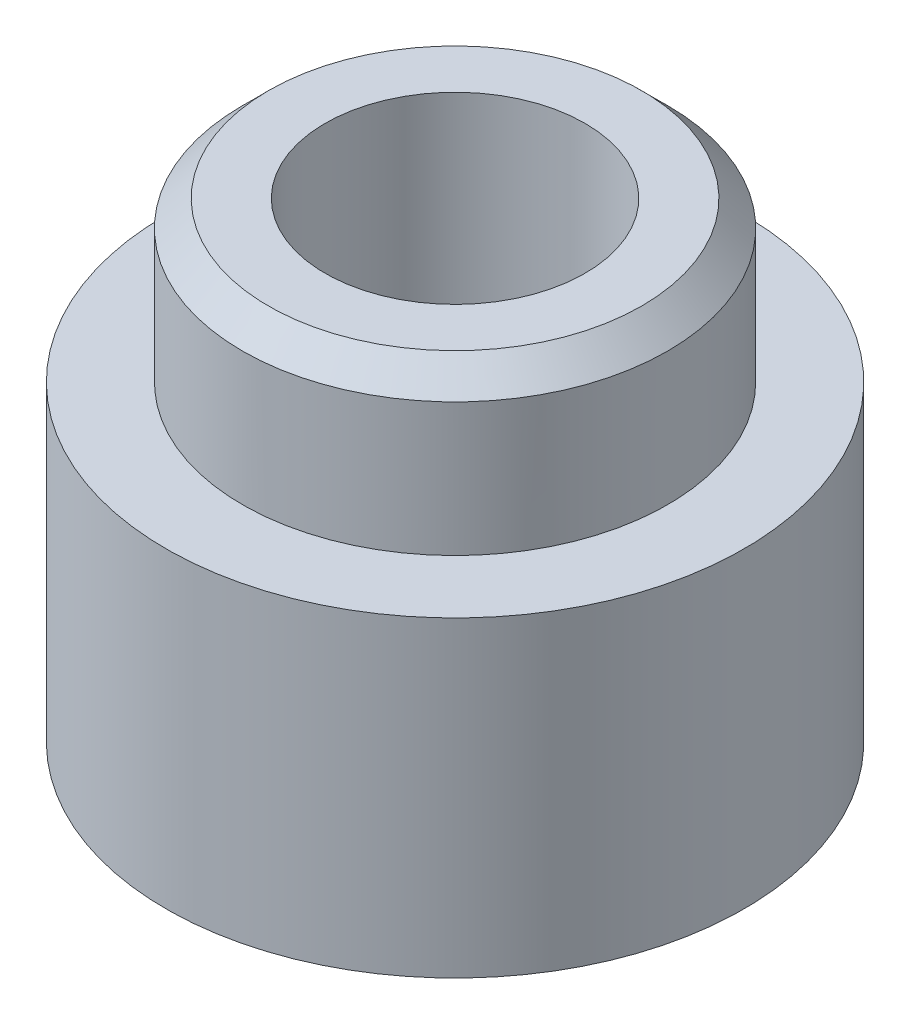
ISO-10303-21;
HEADER;
FILE_DESCRIPTION(('STEP AP214'),'2;1');
FILE_NAME('part.step','',(''),(''),'','','');
FILE_SCHEMA(('AUTOMOTIVE_DESIGN { 1 0 10303 214 1 1 1 1 }'));
ENDSEC;
DATA;
#1=APPLICATION_CONTEXT('core data for automotive mechanical design processes');
#2=APPLICATION_PROTOCOL_DEFINITION('international standard','automotive_design',2000,#1);
#3=PRODUCT_CONTEXT('',#1,'mechanical');
#4=PRODUCT('Part','Part','',(#3));
#5=PRODUCT_RELATED_PRODUCT_CATEGORY('part','',(#4));
#6=PRODUCT_DEFINITION_FORMATION('','',#4);
#7=PRODUCT_DEFINITION_CONTEXT('part definition',#1,'design');
#8=PRODUCT_DEFINITION('design','',#6,#7);
#9=PRODUCT_DEFINITION_SHAPE('','',#8);
#10=(LENGTH_UNIT() NAMED_UNIT(*) SI_UNIT(.MILLI.,.METRE.));
#11=(NAMED_UNIT(*) PLANE_ANGLE_UNIT() SI_UNIT($,.RADIAN.));
#12=(NAMED_UNIT(*) SI_UNIT($,.STERADIAN.) SOLID_ANGLE_UNIT());
#13=UNCERTAINTY_MEASURE_WITH_UNIT(LENGTH_MEASURE(1.E-05),#10,'distance_accuracy_value','');
#14=(GEOMETRIC_REPRESENTATION_CONTEXT(3) GLOBAL_UNCERTAINTY_ASSIGNED_CONTEXT((#13)) GLOBAL_UNIT_ASSIGNED_CONTEXT((#10,
#11,#12)) REPRESENTATION_CONTEXT('',''));
#15=CARTESIAN_POINT('',(0.,0.,0.));
#16=DIRECTION('',(0.,0.,1.));
#17=DIRECTION('',(1.,0.,0.));
#18=AXIS2_PLACEMENT_3D('',#15,#16,#17);
#19=CARTESIAN_POINT('',(0.,0.,0.));
#20=DIRECTION('',(0.,1.,0.));
#21=DIRECTION('',(-1.,0.,0.));
#22=AXIS2_PLACEMENT_3D('',#19,#20,#21);
#23=PLANE('',#22);
#24=CARTESIAN_POINT('',(0.,0.,0.));
#25=DIRECTION('',(0.,-1.,0.));
#26=DIRECTION('',(0.,0.,-1.));
#27=AXIS2_PLACEMENT_3D('',#24,#25,#26);
#28=CIRCLE('',#27,1.25);
#29=CARTESIAN_POINT('',(0.,0.,-1.25));
#30=VERTEX_POINT('',#29);
#31=EDGE_CURVE('E74',#30,#30,#28,.T.);
#32=ORIENTED_EDGE('',*,*,#31,.F.);
#33=EDGE_LOOP('',(#32));
#34=FACE_BOUND('',#33,.T.);
#35=CARTESIAN_POINT('',(0.,0.,0.));
#36=DIRECTION('',(0.,1.,0.));
#37=DIRECTION('',(-1.,0.,0.));
#38=AXIS2_PLACEMENT_3D('',#35,#36,#37);
#39=CIRCLE('',#38,2.78);
#40=CARTESIAN_POINT('',(-2.78,0.,0.));
#41=VERTEX_POINT('',#40);
#42=EDGE_CURVE('E56',#41,#41,#39,.T.);
#43=ORIENTED_EDGE('',*,*,#42,.F.);
#44=EDGE_LOOP('',(#43));
#45=FACE_BOUND('',#44,.T.);
#46=ADVANCED_FACE('F40',(#34,#45),#23,.F.);
#47=CARTESIAN_POINT('',(0.,4.53,0.));
#48=DIRECTION('',(0.,1.,0.));
#49=DIRECTION('',(-1.,0.,0.));
#50=AXIS2_PLACEMENT_3D('',#47,#48,#49);
#51=CYLINDRICAL_SURFACE('',#50,2.78);
#52=CARTESIAN_POINT('',(0.,3.,0.));
#53=DIRECTION('',(0.,1.,0.));
#54=DIRECTION('',(-1.,0.,0.));
#55=AXIS2_PLACEMENT_3D('',#52,#53,#54);
#56=CIRCLE('',#55,2.78);
#57=CARTESIAN_POINT('',(-2.78,3.00000000000001,0.));
#58=VERTEX_POINT('',#57);
#59=EDGE_CURVE('E61',#58,#58,#56,.T.);
#60=ORIENTED_EDGE('',*,*,#59,.F.);
#61=EDGE_LOOP('',(#60));
#62=FACE_BOUND('',#61,.T.);
#63=ORIENTED_EDGE('',*,*,#42,.T.);
#64=EDGE_LOOP('',(#63));
#65=FACE_BOUND('',#64,.T.);
#66=ADVANCED_FACE('F82',(#62,#65),#51,.T.);
#67=CARTESIAN_POINT('',(2.78,3.,0.));
#68=DIRECTION('',(0.,-1.,0.));
#69=DIRECTION('',(1.,0.,0.));
#70=AXIS2_PLACEMENT_3D('',#67,#68,#69);
#71=PLANE('',#70);
#72=CARTESIAN_POINT('',(0.,3.,0.));
#73=DIRECTION('',(0.,1.,0.));
#74=DIRECTION('',(-1.,0.,0.));
#75=AXIS2_PLACEMENT_3D('',#72,#73,#74);
#76=CIRCLE('',#75,2.045);
#77=CARTESIAN_POINT('',(-2.045,3.00000000000001,0.));
#78=VERTEX_POINT('',#77);
#79=EDGE_CURVE('E66',#78,#78,#76,.T.);
#80=ORIENTED_EDGE('',*,*,#79,.F.);
#81=EDGE_LOOP('',(#80));
#82=FACE_BOUND('',#81,.T.);
#83=ORIENTED_EDGE('',*,*,#59,.T.);
#84=EDGE_LOOP('',(#83));
#85=FACE_BOUND('',#84,.T.);
#86=ADVANCED_FACE('F86',(#82,#85),#71,.F.);
#87=CARTESIAN_POINT('',(0.,4.53,0.));
#88=DIRECTION('',(0.,1.,0.));
#89=DIRECTION('',(-1.,0.,0.));
#90=AXIS2_PLACEMENT_3D('',#87,#88,#89);
#91=CYLINDRICAL_SURFACE('',#90,2.045);
#92=CARTESIAN_POINT('',(0.,4.28,0.));
#93=DIRECTION('',(0.,-1.,0.));
#94=DIRECTION('',(1.,0.,0.));
#95=AXIS2_PLACEMENT_3D('',#92,#93,#94);
#96=CIRCLE('',#95,2.045);
#97=CARTESIAN_POINT('',(2.045,4.28,0.));
#98=VERTEX_POINT('',#97);
#99=EDGE_CURVE('E10',#98,#98,#96,.T.);
#100=ORIENTED_EDGE('',*,*,#99,.T.);
#101=EDGE_LOOP('',(#100));
#102=FACE_BOUND('',#101,.T.);
#103=ORIENTED_EDGE('',*,*,#79,.T.);
#104=EDGE_LOOP('',(#103));
#105=FACE_BOUND('',#104,.T.);
#106=ADVANCED_FACE('F92',(#102,#105),#91,.T.);
#107=CARTESIAN_POINT('',(2.045,4.53,0.));
#108=DIRECTION('',(0.,-1.,0.));
#109=DIRECTION('',(1.,0.,0.));
#110=AXIS2_PLACEMENT_3D('',#107,#108,#109);
#111=PLANE('',#110);
#112=CARTESIAN_POINT('',(0.,4.53,0.));
#113=DIRECTION('',(0.,-1.,0.));
#114=DIRECTION('',(0.,0.,-1.));
#115=AXIS2_PLACEMENT_3D('',#112,#113,#114);
#116=CIRCLE('',#115,1.25);
#117=CARTESIAN_POINT('',(0.,4.53,-1.25));
#118=VERTEX_POINT('',#117);
#119=EDGE_CURVE('E70',#118,#118,#116,.T.);
#120=ORIENTED_EDGE('',*,*,#119,.T.);
#121=EDGE_LOOP('',(#120));
#122=FACE_BOUND('',#121,.T.);
#123=CARTESIAN_POINT('',(0.,4.53,0.));
#124=DIRECTION('',(0.,-1.,0.));
#125=DIRECTION('',(1.,0.,0.));
#126=AXIS2_PLACEMENT_3D('',#123,#124,#125);
#127=CIRCLE('',#126,1.795);
#128=CARTESIAN_POINT('',(1.795,4.53,0.));
#129=VERTEX_POINT('',#128);
#130=EDGE_CURVE('E49',#129,#129,#127,.F.);
#131=ORIENTED_EDGE('',*,*,#130,.T.);
#132=EDGE_LOOP('',(#131));
#133=FACE_BOUND('',#132,.T.);
#134=ADVANCED_FACE('F99',(#122,#133),#111,.F.);
#135=CARTESIAN_POINT('',(0.,4.53,0.));
#136=DIRECTION('',(0.,-1.,0.));
#137=DIRECTION('',(1.,0.,0.));
#138=AXIS2_PLACEMENT_3D('',#135,#136,#137);
#139=CONICAL_SURFACE('',#138,1.795,0.785398163397449);
#140=ORIENTED_EDGE('',*,*,#99,.F.);
#141=EDGE_LOOP('',(#140));
#142=FACE_BOUND('',#141,.T.);
#143=ORIENTED_EDGE('',*,*,#130,.F.);
#144=EDGE_LOOP('',(#143));
#145=FACE_BOUND('',#144,.T.);
#146=ADVANCED_FACE('F43',(#142,#145),#139,.T.);
#147=CARTESIAN_POINT('',(0.,0.,0.));
#148=DIRECTION('',(0.,-1.,0.));
#149=DIRECTION('',(0.,0.,-1.));
#150=AXIS2_PLACEMENT_3D('',#147,#148,#149);
#151=CYLINDRICAL_SURFACE('',#150,1.25);
#152=ORIENTED_EDGE('',*,*,#119,.F.);
#153=EDGE_LOOP('',(#152));
#154=FACE_BOUND('',#153,.T.);
#155=ORIENTED_EDGE('',*,*,#31,.T.);
#156=EDGE_LOOP('',(#155));
#157=FACE_BOUND('',#156,.T.);
#158=ADVANCED_FACE('F78',(#154,#157),#151,.F.);
#159=CLOSED_SHELL('',(#46,#66,#86,#106,#134,#146,#158));
#160=MANIFOLD_SOLID_BREP('B2',#159);
#161=ADVANCED_BREP_SHAPE_REPRESENTATION('',(#18,#160),#14);
#162=SHAPE_DEFINITION_REPRESENTATION(#9,#161);
ENDSEC;
END-ISO-10303-21;
